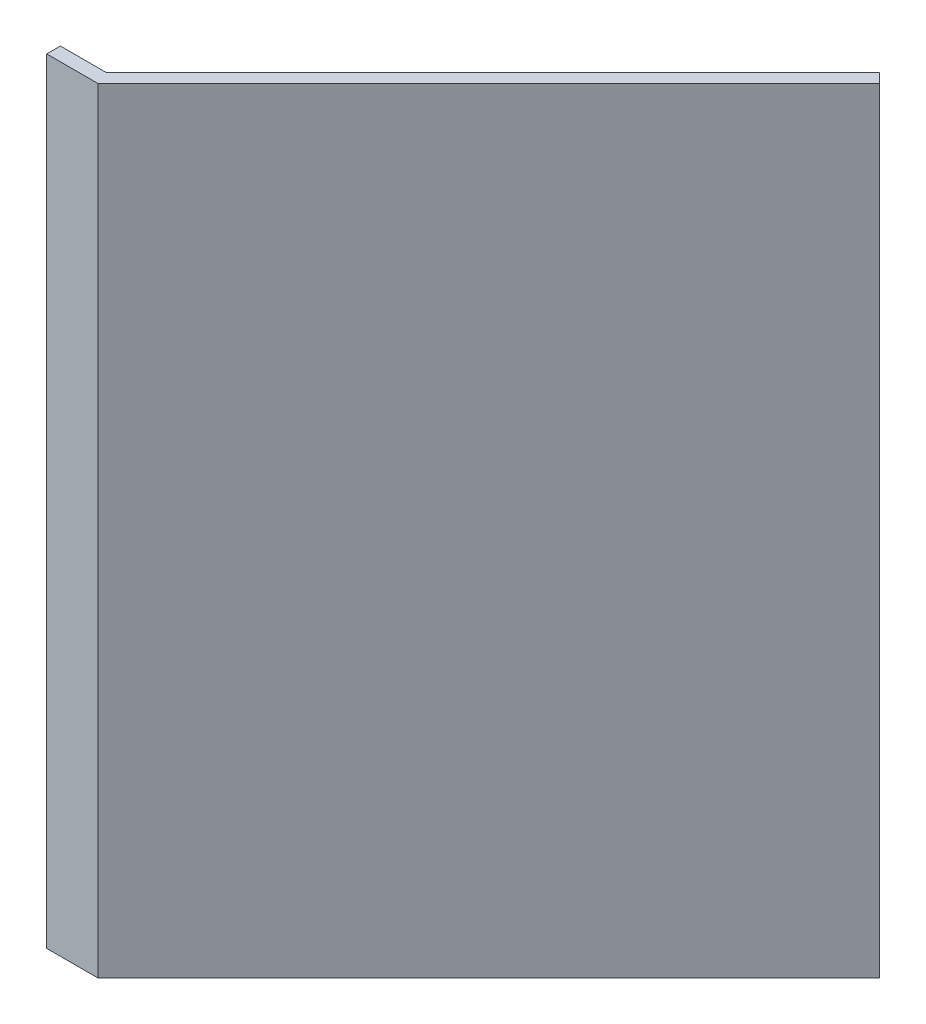
ISO-10303-21;
HEADER;
FILE_DESCRIPTION(('STEP AP214'),'2;1');
FILE_NAME('part.step','',(''),(''),'','','');
FILE_SCHEMA(('AUTOMOTIVE_DESIGN { 1 0 10303 214 1 1 1 1 }'));
ENDSEC;
DATA;
#1=APPLICATION_CONTEXT('core data for automotive mechanical design processes');
#2=APPLICATION_PROTOCOL_DEFINITION('international standard','automotive_design',2000,#1);
#3=PRODUCT_CONTEXT('',#1,'mechanical');
#4=PRODUCT('Part','Part','',(#3));
#5=PRODUCT_RELATED_PRODUCT_CATEGORY('part','',(#4));
#6=PRODUCT_DEFINITION_FORMATION('','',#4);
#7=PRODUCT_DEFINITION_CONTEXT('part definition',#1,'design');
#8=PRODUCT_DEFINITION('design','',#6,#7);
#9=PRODUCT_DEFINITION_SHAPE('','',#8);
#10=(LENGTH_UNIT() NAMED_UNIT(*) SI_UNIT(.MILLI.,.METRE.));
#11=(NAMED_UNIT(*) PLANE_ANGLE_UNIT() SI_UNIT($,.RADIAN.));
#12=(NAMED_UNIT(*) SI_UNIT($,.STERADIAN.) SOLID_ANGLE_UNIT());
#13=UNCERTAINTY_MEASURE_WITH_UNIT(LENGTH_MEASURE(1.E-05),#10,'distance_accuracy_value','');
#14=(GEOMETRIC_REPRESENTATION_CONTEXT(3) GLOBAL_UNCERTAINTY_ASSIGNED_CONTEXT((#13)) GLOBAL_UNIT_ASSIGNED_CONTEXT((#10,
#11,#12)) REPRESENTATION_CONTEXT('',''));
#15=CARTESIAN_POINT('',(0.,0.,0.));
#16=DIRECTION('',(0.,0.,1.));
#17=DIRECTION('',(1.,0.,0.));
#18=AXIS2_PLACEMENT_3D('',#15,#16,#17);
#19=CARTESIAN_POINT('',(0.,170.,77.7091777266991));
#20=DIRECTION('',(0.,0.,1.));
#21=DIRECTION('',(1.,0.,0.));
#22=AXIS2_PLACEMENT_3D('',#19,#20,#21);
#23=PLANE('',#22);
#24=DIRECTION('',(-1.,0.,0.));
#25=VECTOR('',#24,1.);
#26=CARTESIAN_POINT('',(0.,0.,77.7091777266991));
#27=LINE('',#26,#25);
#28=CARTESIAN_POINT('',(-69.6086777646054,0.,77.7091777266991));
#29=VERTEX_POINT('',#28);
#30=CARTESIAN_POINT('',(-80.8513184517243,0.,77.7091777266991));
#31=VERTEX_POINT('',#30);
#32=EDGE_CURVE('E120',#29,#31,#27,.T.);
#33=ORIENTED_EDGE('',*,*,#32,.F.);
#34=DIRECTION('',(0.,-1.,0.));
#35=VECTOR('',#34,1.);
#36=CARTESIAN_POINT('',(-69.6086777646054,170.,77.7091777266991));
#37=LINE('',#36,#35);
#38=CARTESIAN_POINT('',(-69.6086777646054,170.,77.7091777266991));
#39=VERTEX_POINT('',#38);
#40=EDGE_CURVE('E11',#39,#29,#37,.T.);
#41=ORIENTED_EDGE('',*,*,#40,.F.);
#42=DIRECTION('',(-1.,0.,0.));
#43=VECTOR('',#42,1.);
#44=CARTESIAN_POINT('',(0.,170.,77.7091777266991));
#45=LINE('',#44,#43);
#46=CARTESIAN_POINT('',(-80.8513184517243,170.,77.7091777266991));
#47=VERTEX_POINT('',#46);
#48=EDGE_CURVE('E134',#39,#47,#45,.T.);
#49=ORIENTED_EDGE('',*,*,#48,.T.);
#50=DIRECTION('',(0.,-1.,0.));
#51=VECTOR('',#50,1.);
#52=CARTESIAN_POINT('',(-80.8513184517243,170.,77.7091777266991));
#53=LINE('',#52,#51);
#54=EDGE_CURVE('E55',#47,#31,#53,.T.);
#55=ORIENTED_EDGE('',*,*,#54,.T.);
#56=EDGE_LOOP('',(#33,#41,#49,#55));
#57=FACE_BOUND('',#56,.T.);
#58=ADVANCED_FACE('F39',(#57),#23,.T.);
#59=CARTESIAN_POINT('',(4.05024998104685,170.,4.05024998104685));
#60=DIRECTION('',(0.707106781186548,0.,0.707106781186547));
#61=DIRECTION('',(0.707106781186547,0.,-0.707106781186548));
#62=AXIS2_PLACEMENT_3D('',#59,#60,#61);
#63=PLANE('',#62);
#64=DIRECTION('',(-0.707106781186547,0.,0.707106781186548));
#65=VECTOR('',#64,1.);
#66=CARTESIAN_POINT('',(4.05024998104685,0.,4.05024998104685));
#67=LINE('',#66,#65);
#68=CARTESIAN_POINT('',(16.1228156342208,0.,-8.02231567212714));
#69=VERTEX_POINT('',#68);
#70=EDGE_CURVE('E122',#69,#29,#67,.T.);
#71=ORIENTED_EDGE('',*,*,#70,.F.);
#72=DIRECTION('',(0.,-1.,0.));
#73=VECTOR('',#72,1.);
#74=CARTESIAN_POINT('',(16.1228156342208,170.,-8.02231567212714));
#75=LINE('',#74,#73);
#76=CARTESIAN_POINT('',(16.1228156342208,170.,-8.02231567212714));
#77=VERTEX_POINT('',#76);
#78=EDGE_CURVE('E47',#77,#69,#75,.T.);
#79=ORIENTED_EDGE('',*,*,#78,.F.);
#80=DIRECTION('',(-0.707106781186547,0.,0.707106781186548));
#81=VECTOR('',#80,1.);
#82=CARTESIAN_POINT('',(4.05024998104685,170.,4.05024998104685));
#83=LINE('',#82,#81);
#84=EDGE_CURVE('E234',#77,#39,#83,.T.);
#85=ORIENTED_EDGE('',*,*,#84,.T.);
#86=ORIENTED_EDGE('',*,*,#40,.T.);
#87=EDGE_LOOP('',(#71,#79,#85,#86));
#88=FACE_BOUND('',#87,.T.);
#89=ADVANCED_FACE('F143',(#88),#63,.T.);
#90=CARTESIAN_POINT('',(12.072565653174,170.,-12.072565653174));
#91=DIRECTION('',(0.707106781186547,0.,-0.707106781186547));
#92=DIRECTION('',(-0.707106781186548,0.,-0.707106781186548));
#93=AXIS2_PLACEMENT_3D('',#90,#91,#92);
#94=PLANE('',#93);
#95=DIRECTION('',(0.707106781186548,0.,0.707106781186548));
#96=VECTOR('',#95,1.);
#97=CARTESIAN_POINT('',(12.072565653174,0.,-12.072565653174));
#98=LINE('',#97,#96);
#99=CARTESIAN_POINT('',(14.0014952906612,0.,-10.1436360156868));
#100=VERTEX_POINT('',#99);
#101=EDGE_CURVE('E125',#100,#69,#98,.T.);
#102=ORIENTED_EDGE('',*,*,#101,.F.);
#103=DIRECTION('',(0.,-1.,0.));
#104=VECTOR('',#103,1.);
#105=CARTESIAN_POINT('',(14.0014952906612,170.,-10.1436360156868));
#106=LINE('',#105,#104);
#107=CARTESIAN_POINT('',(14.0014952906612,170.,-10.1436360156868));
#108=VERTEX_POINT('',#107);
#109=EDGE_CURVE('E102',#108,#100,#106,.T.);
#110=ORIENTED_EDGE('',*,*,#109,.F.);
#111=DIRECTION('',(0.707106781186548,0.,0.707106781186548));
#112=VECTOR('',#111,1.);
#113=CARTESIAN_POINT('',(12.072565653174,170.,-12.072565653174));
#114=LINE('',#113,#112);
#115=EDGE_CURVE('E112',#108,#77,#114,.T.);
#116=ORIENTED_EDGE('',*,*,#115,.T.);
#117=ORIENTED_EDGE('',*,*,#78,.T.);
#118=EDGE_LOOP('',(#102,#110,#116,#117));
#119=FACE_BOUND('',#118,.T.);
#120=ADVANCED_FACE('F140',(#119),#94,.T.);
#121=CARTESIAN_POINT('',(1.92892963748723,170.,1.92892963748722));
#122=DIRECTION('',(-0.707106781186549,0.,-0.707106781186546));
#123=DIRECTION('',(-0.707106781186546,0.,0.707106781186549));
#124=AXIS2_PLACEMENT_3D('',#121,#122,#123);
#125=PLANE('',#124);
#126=DIRECTION('',(0.707106781186546,0.,-0.707106781186549));
#127=VECTOR('',#126,1.);
#128=CARTESIAN_POINT('',(1.92892963748723,0.,1.92892963748722));
#129=LINE('',#128,#127);
#130=CARTESIAN_POINT('',(-70.8513184517243,0.,74.7091777266991));
#131=VERTEX_POINT('',#130);
#132=EDGE_CURVE('E98',#131,#100,#129,.T.);
#133=ORIENTED_EDGE('',*,*,#132,.F.);
#134=DIRECTION('',(0.,-1.,0.));
#135=VECTOR('',#134,1.);
#136=CARTESIAN_POINT('',(-70.8513184517243,170.,74.7091777266991));
#137=LINE('',#136,#135);
#138=CARTESIAN_POINT('',(-70.8513184517243,170.,74.7091777266991));
#139=VERTEX_POINT('',#138);
#140=EDGE_CURVE('E93',#139,#131,#137,.T.);
#141=ORIENTED_EDGE('',*,*,#140,.F.);
#142=DIRECTION('',(0.707106781186546,0.,-0.707106781186549));
#143=VECTOR('',#142,1.);
#144=CARTESIAN_POINT('',(1.92892963748723,170.,1.92892963748722));
#145=LINE('',#144,#143);
#146=EDGE_CURVE('E96',#139,#108,#145,.T.);
#147=ORIENTED_EDGE('',*,*,#146,.T.);
#148=ORIENTED_EDGE('',*,*,#109,.T.);
#149=EDGE_LOOP('',(#133,#141,#147,#148));
#150=FACE_BOUND('',#149,.T.);
#151=ADVANCED_FACE('F95',(#150),#125,.T.);
#152=CARTESIAN_POINT('',(0.,170.,74.7091777266991));
#153=DIRECTION('',(0.,0.,-1.));
#154=DIRECTION('',(-1.,0.,0.));
#155=AXIS2_PLACEMENT_3D('',#152,#153,#154);
#156=PLANE('',#155);
#157=DIRECTION('',(1.,0.,0.));
#158=VECTOR('',#157,1.);
#159=CARTESIAN_POINT('',(0.,0.,74.7091777266991));
#160=LINE('',#159,#158);
#161=CARTESIAN_POINT('',(-80.8513184517243,0.,74.7091777266991));
#162=VERTEX_POINT('',#161);
#163=EDGE_CURVE('E129',#162,#131,#160,.T.);
#164=ORIENTED_EDGE('',*,*,#163,.F.);
#165=DIRECTION('',(0.,-1.,0.));
#166=VECTOR('',#165,1.);
#167=CARTESIAN_POINT('',(-80.8513184517243,170.,74.7091777266991));
#168=LINE('',#167,#166);
#169=CARTESIAN_POINT('',(-80.8513184517243,170.,74.7091777266991));
#170=VERTEX_POINT('',#169);
#171=EDGE_CURVE('E74',#170,#162,#168,.T.);
#172=ORIENTED_EDGE('',*,*,#171,.F.);
#173=DIRECTION('',(1.,0.,0.));
#174=VECTOR('',#173,1.);
#175=CARTESIAN_POINT('',(0.,170.,74.7091777266991));
#176=LINE('',#175,#174);
#177=EDGE_CURVE('E109',#170,#139,#176,.T.);
#178=ORIENTED_EDGE('',*,*,#177,.T.);
#179=ORIENTED_EDGE('',*,*,#140,.T.);
#180=EDGE_LOOP('',(#164,#172,#178,#179));
#181=FACE_BOUND('',#180,.T.);
#182=ADVANCED_FACE('F114',(#181),#156,.T.);
#183=CARTESIAN_POINT('',(-80.8513184517243,170.,0.));
#184=DIRECTION('',(-1.,0.,0.));
#185=DIRECTION('',(0.,0.,1.));
#186=AXIS2_PLACEMENT_3D('',#183,#184,#185);
#187=PLANE('',#186);
#188=DIRECTION('',(0.,0.,-1.));
#189=VECTOR('',#188,1.);
#190=CARTESIAN_POINT('',(-80.8513184517243,0.,0.));
#191=LINE('',#190,#189);
#192=EDGE_CURVE('E131',#31,#162,#191,.T.);
#193=ORIENTED_EDGE('',*,*,#192,.F.);
#194=ORIENTED_EDGE('',*,*,#54,.F.);
#195=DIRECTION('',(0.,0.,-1.));
#196=VECTOR('',#195,1.);
#197=CARTESIAN_POINT('',(-80.8513184517243,170.,0.));
#198=LINE('',#197,#196);
#199=EDGE_CURVE('E115',#47,#170,#198,.T.);
#200=ORIENTED_EDGE('',*,*,#199,.T.);
#201=ORIENTED_EDGE('',*,*,#171,.T.);
#202=EDGE_LOOP('',(#193,#194,#200,#201));
#203=FACE_BOUND('',#202,.T.);
#204=ADVANCED_FACE('F146',(#203),#187,.T.);
#205=CARTESIAN_POINT('',(0.,170.,0.));
#206=DIRECTION('',(0.,1.,0.));
#207=DIRECTION('',(0.,0.,1.));
#208=AXIS2_PLACEMENT_3D('',#205,#206,#207);
#209=PLANE('',#208);
#210=ORIENTED_EDGE('',*,*,#48,.F.);
#211=ORIENTED_EDGE('',*,*,#84,.F.);
#212=ORIENTED_EDGE('',*,*,#115,.F.);
#213=ORIENTED_EDGE('',*,*,#146,.F.);
#214=ORIENTED_EDGE('',*,*,#177,.F.);
#215=ORIENTED_EDGE('',*,*,#199,.F.);
#216=EDGE_LOOP('',(#210,#211,#212,#213,#214,#215));
#217=FACE_BOUND('',#216,.T.);
#218=ADVANCED_FACE('F107',(#217),#209,.T.);
#219=CARTESIAN_POINT('',(0.,0.,0.));
#220=DIRECTION('',(0.,1.,0.));
#221=DIRECTION('',(0.,0.,1.));
#222=AXIS2_PLACEMENT_3D('',#219,#220,#221);
#223=PLANE('',#222);
#224=ORIENTED_EDGE('',*,*,#32,.T.);
#225=ORIENTED_EDGE('',*,*,#192,.T.);
#226=ORIENTED_EDGE('',*,*,#163,.T.);
#227=ORIENTED_EDGE('',*,*,#132,.T.);
#228=ORIENTED_EDGE('',*,*,#101,.T.);
#229=ORIENTED_EDGE('',*,*,#70,.T.);
#230=EDGE_LOOP('',(#224,#225,#226,#227,#228,#229));
#231=FACE_BOUND('',#230,.T.);
#232=ADVANCED_FACE('F145',(#231),#223,.F.);
#233=CLOSED_SHELL('',(#58,#89,#120,#151,#182,#204,#218,#232));
#234=MANIFOLD_SOLID_BREP('B2',#233);
#235=ADVANCED_BREP_SHAPE_REPRESENTATION('',(#18,#234),#14);
#236=SHAPE_DEFINITION_REPRESENTATION(#9,#235);
ENDSEC;
END-ISO-10303-21;
